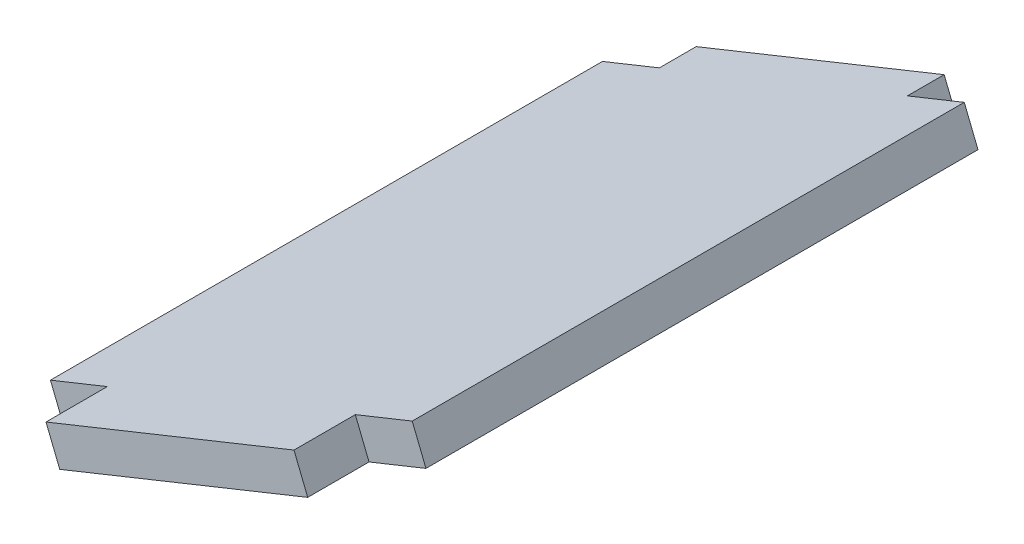
ISO-10303-21;
HEADER;
FILE_DESCRIPTION(('STEP AP214'),'2;1');
FILE_NAME('part.step','',(''),(''),'','','');
FILE_SCHEMA(('AUTOMOTIVE_DESIGN { 1 0 10303 214 1 1 1 1 }'));
ENDSEC;
DATA;
#1=APPLICATION_CONTEXT('core data for automotive mechanical design processes');
#2=APPLICATION_PROTOCOL_DEFINITION('international standard','automotive_design',2000,#1);
#3=PRODUCT_CONTEXT('',#1,'mechanical');
#4=PRODUCT('Part','Part','',(#3));
#5=PRODUCT_RELATED_PRODUCT_CATEGORY('part','',(#4));
#6=PRODUCT_DEFINITION_FORMATION('','',#4);
#7=PRODUCT_DEFINITION_CONTEXT('part definition',#1,'design');
#8=PRODUCT_DEFINITION('design','',#6,#7);
#9=PRODUCT_DEFINITION_SHAPE('','',#8);
#10=(LENGTH_UNIT() NAMED_UNIT(*) SI_UNIT(.MILLI.,.METRE.));
#11=(NAMED_UNIT(*) PLANE_ANGLE_UNIT() SI_UNIT($,.RADIAN.));
#12=(NAMED_UNIT(*) SI_UNIT($,.STERADIAN.) SOLID_ANGLE_UNIT());
#13=UNCERTAINTY_MEASURE_WITH_UNIT(LENGTH_MEASURE(1.E-05),#10,'distance_accuracy_value','');
#14=(GEOMETRIC_REPRESENTATION_CONTEXT(3) GLOBAL_UNCERTAINTY_ASSIGNED_CONTEXT((#13)) GLOBAL_UNIT_ASSIGNED_CONTEXT((#10,
#11,#12)) REPRESENTATION_CONTEXT('',''));
#15=CARTESIAN_POINT('',(0.,0.,0.));
#16=DIRECTION('',(0.,0.,1.));
#17=DIRECTION('',(1.,0.,0.));
#18=AXIS2_PLACEMENT_3D('',#15,#16,#17);
#19=CARTESIAN_POINT('',(177.803209237154,-77.3779118691354,-71.9612262261891));
#20=DIRECTION('',(0.92781674820167,0.373036300856202,0.));
#21=DIRECTION('',(-0.373036300856202,0.92781674820167,0.));
#22=AXIS2_PLACEMENT_3D('',#19,#20,#21);
#23=PLANE('',#22);
#24=DIRECTION('',(0.,0.,1.));
#25=VECTOR('',#24,1.);
#26=CARTESIAN_POINT('',(178.922318139722,-80.1613621137405,-71.9612262261891));
#27=LINE('',#26,#25);
#28=CARTESIAN_POINT('',(178.922318139723,-80.1613621137401,0.));
#29=VERTEX_POINT('',#28);
#30=CARTESIAN_POINT('',(178.922318139722,-80.1613621137405,5.));
#31=VERTEX_POINT('',#30);
#32=EDGE_CURVE('E146',#29,#31,#27,.T.);
#33=ORIENTED_EDGE('',*,*,#32,.T.);
#34=DIRECTION('',(-0.373036300856202,0.92781674820167,0.));
#35=VECTOR('',#34,1.);
#36=CARTESIAN_POINT('',(177.803209237154,-77.3779118691354,5.));
#37=LINE('',#36,#35);
#38=CARTESIAN_POINT('',(177.803209237154,-77.3779118691354,5.));
#39=VERTEX_POINT('',#38);
#40=EDGE_CURVE('E230',#31,#39,#37,.T.);
#41=ORIENTED_EDGE('',*,*,#40,.T.);
#42=DIRECTION('',(0.,0.,1.));
#43=VECTOR('',#42,1.);
#44=CARTESIAN_POINT('',(177.803209237154,-77.3779118691354,-71.9612262261891));
#45=LINE('',#44,#43);
#46=CARTESIAN_POINT('',(177.803209237154,-77.3779118691352,0.));
#47=VERTEX_POINT('',#46);
#48=EDGE_CURVE('E196',#47,#39,#45,.T.);
#49=ORIENTED_EDGE('',*,*,#48,.F.);
#50=DIRECTION('',(-0.373036300856202,0.92781674820167,0.));
#51=VECTOR('',#50,1.);
#52=CARTESIAN_POINT('',(177.803209237154,-77.3779118691352,0.));
#53=LINE('',#52,#51);
#54=EDGE_CURVE('E154',#29,#47,#53,.T.);
#55=ORIENTED_EDGE('',*,*,#54,.F.);
#56=EDGE_LOOP('',(#33,#41,#49,#55));
#57=FACE_BOUND('',#56,.T.);
#58=ADVANCED_FACE('F33',(#57),#23,.F.);
#59=CARTESIAN_POINT('',(199.136249233887,-72.0341860353339,-71.9612262261891));
#60=DIRECTION('',(-0.927816748201669,-0.373036300856205,0.));
#61=DIRECTION('',(0.373036300856205,-0.927816748201669,0.));
#62=AXIS2_PLACEMENT_3D('',#59,#60,#61);
#63=PLANE('',#62);
#64=DIRECTION('',(-0.373036300856208,0.927816748201667,0.));
#65=VECTOR('',#64,1.);
#66=CARTESIAN_POINT('',(198.017140331318,-69.2507357907289,0.));
#67=LINE('',#66,#65);
#68=CARTESIAN_POINT('',(199.136249233887,-72.0341860353339,0.));
#69=VERTEX_POINT('',#68);
#70=CARTESIAN_POINT('',(198.017140331318,-69.2507357907289,0.));
#71=VERTEX_POINT('',#70);
#72=EDGE_CURVE('E147',#69,#71,#67,.T.);
#73=ORIENTED_EDGE('',*,*,#72,.T.);
#74=DIRECTION('',(0.,0.,1.));
#75=VECTOR('',#74,1.);
#76=CARTESIAN_POINT('',(198.017140331318,-69.2507357907289,-71.9612262261891));
#77=LINE('',#76,#75);
#78=CARTESIAN_POINT('',(198.017140331318,-69.2507357907289,5.));
#79=VERTEX_POINT('',#78);
#80=EDGE_CURVE('E216',#71,#79,#77,.T.);
#81=ORIENTED_EDGE('',*,*,#80,.T.);
#82=DIRECTION('',(0.373036300856205,-0.927816748201669,0.));
#83=VECTOR('',#82,1.);
#84=CARTESIAN_POINT('',(199.136249233887,-72.0341860353339,5.));
#85=LINE('',#84,#83);
#86=CARTESIAN_POINT('',(199.136249233887,-72.0341860353339,5.));
#87=VERTEX_POINT('',#86);
#88=EDGE_CURVE('E225',#79,#87,#85,.T.);
#89=ORIENTED_EDGE('',*,*,#88,.T.);
#90=DIRECTION('',(0.,0.,1.));
#91=VECTOR('',#90,1.);
#92=CARTESIAN_POINT('',(199.136249233887,-72.0341860353339,-71.9612262261891));
#93=LINE('',#92,#91);
#94=EDGE_CURVE('E209',#69,#87,#93,.T.);
#95=ORIENTED_EDGE('',*,*,#94,.F.);
#96=EDGE_LOOP('',(#73,#81,#89,#95));
#97=FACE_BOUND('',#96,.T.);
#98=ADVANCED_FACE('F263',(#97),#63,.F.);
#99=DIRECTION('',(0.373036300856205,-0.927816748201669,0.));
#100=VECTOR('',#99,1.);
#101=CARTESIAN_POINT('',(198.017140331318,-69.2507357907289,-45.));
#102=LINE('',#101,#100);
#103=CARTESIAN_POINT('',(198.017140331318,-69.2507357907289,-45.));
#104=VERTEX_POINT('',#103);
#105=CARTESIAN_POINT('',(199.136249233887,-72.0341860353339,-45.));
#106=VERTEX_POINT('',#105);
#107=EDGE_CURVE('E149',#104,#106,#102,.T.);
#108=ORIENTED_EDGE('',*,*,#107,.T.);
#109=CARTESIAN_POINT('',(199.136249233887,-72.0341860353339,-48.));
#110=VERTEX_POINT('',#109);
#111=EDGE_CURVE('E206',#110,#106,#93,.T.);
#112=ORIENTED_EDGE('',*,*,#111,.F.);
#113=DIRECTION('',(-0.373036300856205,0.927816748201669,0.));
#114=VECTOR('',#113,1.);
#115=CARTESIAN_POINT('',(199.136249233887,-72.0341860353339,-48.));
#116=LINE('',#115,#114);
#117=CARTESIAN_POINT('',(198.017140331318,-69.2507357907289,-48.));
#118=VERTEX_POINT('',#117);
#119=EDGE_CURVE('E193',#110,#118,#116,.T.);
#120=ORIENTED_EDGE('',*,*,#119,.T.);
#121=EDGE_CURVE('E213',#118,#104,#77,.T.);
#122=ORIENTED_EDGE('',*,*,#121,.T.);
#123=EDGE_LOOP('',(#108,#112,#120,#122));
#124=FACE_BOUND('',#123,.T.);
#125=ADVANCED_FACE('F271',(#124),#63,.F.);
#126=CARTESIAN_POINT('',(198.017140331318,-69.2507357907289,-71.9612262261891));
#127=DIRECTION('',(0.373036300856209,-0.927816748201667,0.));
#128=DIRECTION('',(0.927816748201667,0.373036300856209,0.));
#129=AXIS2_PLACEMENT_3D('',#126,#127,#128);
#130=PLANE('',#129);
#131=DIRECTION('',(-0.927816748201667,-0.373036300856209,0.));
#132=VECTOR('',#131,1.);
#133=CARTESIAN_POINT('',(198.017140331318,-69.2507357907289,-48.));
#134=LINE('',#133,#132);
#135=CARTESIAN_POINT('',(177.803209237154,-77.3779118691354,-48.));
#136=VERTEX_POINT('',#135);
#137=EDGE_CURVE('E42',#118,#136,#134,.T.);
#138=ORIENTED_EDGE('',*,*,#137,.T.);
#139=CARTESIAN_POINT('',(177.803209237154,-77.3779118691351,-45.));
#140=VERTEX_POINT('',#139);
#141=EDGE_CURVE('E185',#136,#140,#45,.T.);
#142=ORIENTED_EDGE('',*,*,#141,.T.);
#143=DIRECTION('',(0.927816748201669,0.373036300856205,0.));
#144=VECTOR('',#143,1.);
#145=CARTESIAN_POINT('',(173.164125496146,-79.2430933734162,-45.));
#146=LINE('',#145,#144);
#147=CARTESIAN_POINT('',(173.164125496146,-79.2430933734162,-45.));
#148=VERTEX_POINT('',#147);
#149=EDGE_CURVE('E151',#148,#140,#146,.T.);
#150=ORIENTED_EDGE('',*,*,#149,.F.);
#151=DIRECTION('',(0.,0.,-1.));
#152=VECTOR('',#151,1.);
#153=CARTESIAN_POINT('',(173.164125496146,-79.2430933734162,0.));
#154=LINE('',#153,#152);
#155=CARTESIAN_POINT('',(173.164125496146,-79.2430933734162,0.));
#156=VERTEX_POINT('',#155);
#157=EDGE_CURVE('E162',#156,#148,#154,.T.);
#158=ORIENTED_EDGE('',*,*,#157,.F.);
#159=DIRECTION('',(0.927816748201669,0.373036300856205,0.));
#160=VECTOR('',#159,1.);
#161=CARTESIAN_POINT('',(173.164125496146,-79.2430933734162,0.));
#162=LINE('',#161,#160);
#163=EDGE_CURVE('E133',#156,#47,#162,.T.);
#164=ORIENTED_EDGE('',*,*,#163,.T.);
#165=ORIENTED_EDGE('',*,*,#48,.T.);
#166=DIRECTION('',(0.927816748201667,0.373036300856209,0.));
#167=VECTOR('',#166,1.);
#168=CARTESIAN_POINT('',(198.017140331318,-69.2507357907289,5.));
#169=LINE('',#168,#167);
#170=EDGE_CURVE('E212',#39,#79,#169,.T.);
#171=ORIENTED_EDGE('',*,*,#170,.T.);
#172=ORIENTED_EDGE('',*,*,#80,.F.);
#173=DIRECTION('',(-0.927816748201669,-0.373036300856205,0.));
#174=VECTOR('',#173,1.);
#175=CARTESIAN_POINT('',(202.656224072327,-67.3855542864479,0.));
#176=LINE('',#175,#174);
#177=CARTESIAN_POINT('',(202.656224072327,-67.3855542864479,0.));
#178=VERTEX_POINT('',#177);
#179=EDGE_CURVE('E58',#178,#71,#176,.T.);
#180=ORIENTED_EDGE('',*,*,#179,.F.);
#181=DIRECTION('',(0.,0.,-1.));
#182=VECTOR('',#181,1.);
#183=CARTESIAN_POINT('',(202.656224072327,-67.3855542864479,0.));
#184=LINE('',#183,#182);
#185=CARTESIAN_POINT('',(202.656224072327,-67.3855542864479,-45.));
#186=VERTEX_POINT('',#185);
#187=EDGE_CURVE('E281',#178,#186,#184,.T.);
#188=ORIENTED_EDGE('',*,*,#187,.T.);
#189=DIRECTION('',(-0.927816748201669,-0.373036300856205,0.));
#190=VECTOR('',#189,1.);
#191=CARTESIAN_POINT('',(202.656224072327,-67.3855542864479,-45.));
#192=LINE('',#191,#190);
#193=EDGE_CURVE('E241',#186,#104,#192,.T.);
#194=ORIENTED_EDGE('',*,*,#193,.T.);
#195=ORIENTED_EDGE('',*,*,#121,.F.);
#196=EDGE_LOOP('',(#138,#142,#150,#158,#164,#165,#171,#172,#180,#188,#194,#195));
#197=FACE_BOUND('',#196,.T.);
#198=ADVANCED_FACE('F183',(#197),#130,.F.);
#199=ORIENTED_EDGE('',*,*,#141,.F.);
#200=DIRECTION('',(0.373036300856202,-0.92781674820167,0.));
#201=VECTOR('',#200,1.);
#202=CARTESIAN_POINT('',(177.803209237154,-77.3779118691354,-48.));
#203=LINE('',#202,#201);
#204=CARTESIAN_POINT('',(178.922318139722,-80.1613621137405,-48.));
#205=VERTEX_POINT('',#204);
#206=EDGE_CURVE('E11',#136,#205,#203,.T.);
#207=ORIENTED_EDGE('',*,*,#206,.T.);
#208=CARTESIAN_POINT('',(178.922318139722,-80.1613621137405,-45.));
#209=VERTEX_POINT('',#208);
#210=EDGE_CURVE('E190',#205,#209,#27,.T.);
#211=ORIENTED_EDGE('',*,*,#210,.T.);
#212=DIRECTION('',(0.373036300856205,-0.927816748201669,0.));
#213=VECTOR('',#212,1.);
#214=CARTESIAN_POINT('',(177.803209237154,-77.3779118691351,-45.));
#215=LINE('',#214,#213);
#216=EDGE_CURVE('E138',#140,#209,#215,.T.);
#217=ORIENTED_EDGE('',*,*,#216,.F.);
#218=EDGE_LOOP('',(#199,#207,#211,#217));
#219=FACE_BOUND('',#218,.T.);
#220=ADVANCED_FACE('F191',(#219),#23,.F.);
#221=CARTESIAN_POINT('',(178.922318139722,-80.1613621137405,-71.9612262261891));
#222=DIRECTION('',(-0.37303630085621,0.927816748201667,0.));
#223=DIRECTION('',(-0.927816748201667,-0.37303630085621,0.));
#224=AXIS2_PLACEMENT_3D('',#221,#222,#223);
#225=PLANE('',#224);
#226=DIRECTION('',(0.927816748201667,0.37303630085621,0.));
#227=VECTOR('',#226,1.);
#228=CARTESIAN_POINT('',(178.922318139722,-80.1613621137405,-48.));
#229=LINE('',#228,#227);
#230=EDGE_CURVE('E192',#205,#110,#229,.T.);
#231=ORIENTED_EDGE('',*,*,#230,.T.);
#232=ORIENTED_EDGE('',*,*,#111,.T.);
#233=DIRECTION('',(-0.927816748201669,-0.373036300856205,0.));
#234=VECTOR('',#233,1.);
#235=CARTESIAN_POINT('',(203.775332974895,-70.1690045310529,-45.));
#236=LINE('',#235,#234);
#237=CARTESIAN_POINT('',(203.775332974895,-70.1690045310529,-45.));
#238=VERTEX_POINT('',#237);
#239=EDGE_CURVE('E239',#238,#106,#236,.T.);
#240=ORIENTED_EDGE('',*,*,#239,.F.);
#241=DIRECTION('',(0.,0.,1.));
#242=VECTOR('',#241,1.);
#243=CARTESIAN_POINT('',(203.775332974895,-70.1690045310529,0.));
#244=LINE('',#243,#242);
#245=CARTESIAN_POINT('',(203.775332974895,-70.1690045310529,0.));
#246=VERTEX_POINT('',#245);
#247=EDGE_CURVE('E252',#238,#246,#244,.T.);
#248=ORIENTED_EDGE('',*,*,#247,.T.);
#249=DIRECTION('',(-0.927816748201669,-0.373036300856205,0.));
#250=VECTOR('',#249,1.);
#251=CARTESIAN_POINT('',(203.775332974895,-70.1690045310529,0.));
#252=LINE('',#251,#250);
#253=EDGE_CURVE('E242',#246,#69,#252,.T.);
#254=ORIENTED_EDGE('',*,*,#253,.T.);
#255=ORIENTED_EDGE('',*,*,#94,.T.);
#256=DIRECTION('',(-0.927816748201667,-0.37303630085621,0.));
#257=VECTOR('',#256,1.);
#258=CARTESIAN_POINT('',(178.922318139722,-80.1613621137405,5.));
#259=LINE('',#258,#257);
#260=EDGE_CURVE('E228',#87,#31,#259,.T.);
#261=ORIENTED_EDGE('',*,*,#260,.T.);
#262=ORIENTED_EDGE('',*,*,#32,.F.);
#263=DIRECTION('',(0.927816748201669,0.373036300856205,0.));
#264=VECTOR('',#263,1.);
#265=CARTESIAN_POINT('',(174.283234398714,-82.0265436180212,0.));
#266=LINE('',#265,#264);
#267=CARTESIAN_POINT('',(174.283234398714,-82.0265436180212,0.));
#268=VERTEX_POINT('',#267);
#269=EDGE_CURVE('E131',#268,#29,#266,.T.);
#270=ORIENTED_EDGE('',*,*,#269,.F.);
#271=DIRECTION('',(0.,0.,1.));
#272=VECTOR('',#271,1.);
#273=CARTESIAN_POINT('',(174.283234398714,-82.0265436180212,0.));
#274=LINE('',#273,#272);
#275=CARTESIAN_POINT('',(174.283234398714,-82.0265436180212,-45.));
#276=VERTEX_POINT('',#275);
#277=EDGE_CURVE('E137',#276,#268,#274,.T.);
#278=ORIENTED_EDGE('',*,*,#277,.F.);
#279=DIRECTION('',(0.927816748201669,0.373036300856205,0.));
#280=VECTOR('',#279,1.);
#281=CARTESIAN_POINT('',(174.283234398714,-82.0265436180212,-45.));
#282=LINE('',#281,#280);
#283=EDGE_CURVE('E50',#276,#209,#282,.T.);
#284=ORIENTED_EDGE('',*,*,#283,.T.);
#285=ORIENTED_EDGE('',*,*,#210,.F.);
#286=EDGE_LOOP('',(#231,#232,#240,#248,#254,#255,#261,#262,#270,#278,#284,#285));
#287=FACE_BOUND('',#286,.T.);
#288=ADVANCED_FACE('F144',(#287),#225,.F.);
#289=CARTESIAN_POINT('',(0.,0.,-48.));
#290=DIRECTION('',(0.,0.,-1.));
#291=DIRECTION('',(0.,-1.,0.));
#292=AXIS2_PLACEMENT_3D('',#289,#290,#291);
#293=PLANE('',#292);
#294=ORIENTED_EDGE('',*,*,#230,.F.);
#295=ORIENTED_EDGE('',*,*,#206,.F.);
#296=ORIENTED_EDGE('',*,*,#137,.F.);
#297=ORIENTED_EDGE('',*,*,#119,.F.);
#298=EDGE_LOOP('',(#294,#295,#296,#297));
#299=FACE_BOUND('',#298,.T.);
#300=ADVANCED_FACE('F35',(#299),#293,.T.);
#301=CARTESIAN_POINT('',(0.,0.,5.));
#302=DIRECTION('',(0.,0.,-1.));
#303=DIRECTION('',(0.,-1.,0.));
#304=AXIS2_PLACEMENT_3D('',#301,#302,#303);
#305=PLANE('',#304);
#306=ORIENTED_EDGE('',*,*,#88,.F.);
#307=ORIENTED_EDGE('',*,*,#170,.F.);
#308=ORIENTED_EDGE('',*,*,#40,.F.);
#309=ORIENTED_EDGE('',*,*,#260,.F.);
#310=EDGE_LOOP('',(#306,#307,#308,#309));
#311=FACE_BOUND('',#310,.T.);
#312=ADVANCED_FACE('F259',(#311),#305,.F.);
#313=CARTESIAN_POINT('',(202.656224072327,-67.3855542864479,0.));
#314=DIRECTION('',(0.,0.,-1.));
#315=DIRECTION('',(0.,-1.,0.));
#316=AXIS2_PLACEMENT_3D('',#313,#314,#315);
#317=PLANE('',#316);
#318=ORIENTED_EDGE('',*,*,#72,.F.);
#319=ORIENTED_EDGE('',*,*,#253,.F.);
#320=DIRECTION('',(-0.373036300856208,0.927816748201667,0.));
#321=VECTOR('',#320,1.);
#322=CARTESIAN_POINT('',(202.656224072327,-67.3855542864479,0.));
#323=LINE('',#322,#321);
#324=EDGE_CURVE('E166',#246,#178,#323,.T.);
#325=ORIENTED_EDGE('',*,*,#324,.T.);
#326=ORIENTED_EDGE('',*,*,#179,.T.);
#327=EDGE_LOOP('',(#318,#319,#325,#326));
#328=FACE_BOUND('',#327,.T.);
#329=ADVANCED_FACE('F285',(#328),#317,.F.);
#330=CARTESIAN_POINT('',(202.656224072327,-67.3855542864479,-45.));
#331=DIRECTION('',(0.,0.,1.));
#332=DIRECTION('',(-1.,0.,0.));
#333=AXIS2_PLACEMENT_3D('',#330,#331,#332);
#334=PLANE('',#333);
#335=ORIENTED_EDGE('',*,*,#107,.F.);
#336=ORIENTED_EDGE('',*,*,#193,.F.);
#337=DIRECTION('',(0.373036300856205,-0.927816748201669,0.));
#338=VECTOR('',#337,1.);
#339=CARTESIAN_POINT('',(202.656224072327,-67.3855542864479,-45.));
#340=LINE('',#339,#338);
#341=EDGE_CURVE('E277',#186,#238,#340,.T.);
#342=ORIENTED_EDGE('',*,*,#341,.T.);
#343=ORIENTED_EDGE('',*,*,#239,.T.);
#344=EDGE_LOOP('',(#335,#336,#342,#343));
#345=FACE_BOUND('',#344,.T.);
#346=ADVANCED_FACE('F275',(#345),#334,.F.);
#347=CARTESIAN_POINT('',(151.132609101368,60.7640997505116,0.));
#348=DIRECTION('',(-0.927816748201668,-0.373036300856208,0.));
#349=DIRECTION('',(0.373036300856208,-0.927816748201668,0.));
#350=AXIS2_PLACEMENT_3D('',#347,#348,#349);
#351=PLANE('',#350);
#352=ORIENTED_EDGE('',*,*,#324,.F.);
#353=ORIENTED_EDGE('',*,*,#247,.F.);
#354=ORIENTED_EDGE('',*,*,#341,.F.);
#355=ORIENTED_EDGE('',*,*,#187,.F.);
#356=EDGE_LOOP('',(#352,#353,#354,#355));
#357=FACE_BOUND('',#356,.T.);
#358=ADVANCED_FACE('F283',(#357),#351,.F.);
#359=CARTESIAN_POINT('',(173.164125496146,-79.2430933734162,0.));
#360=DIRECTION('',(0.,0.,1.));
#361=DIRECTION('',(0.,1.,0.));
#362=AXIS2_PLACEMENT_3D('',#359,#360,#361);
#363=PLANE('',#362);
#364=ORIENTED_EDGE('',*,*,#54,.T.);
#365=ORIENTED_EDGE('',*,*,#163,.F.);
#366=DIRECTION('',(-0.373036300856202,0.92781674820167,0.));
#367=VECTOR('',#366,1.);
#368=CARTESIAN_POINT('',(173.164125496146,-79.2430933734162,0.));
#369=LINE('',#368,#367);
#370=EDGE_CURVE('E126',#268,#156,#369,.T.);
#371=ORIENTED_EDGE('',*,*,#370,.F.);
#372=ORIENTED_EDGE('',*,*,#269,.T.);
#373=EDGE_LOOP('',(#364,#365,#371,#372));
#374=FACE_BOUND('',#373,.T.);
#375=ADVANCED_FACE('F129',(#374),#363,.T.);
#376=CARTESIAN_POINT('',(173.164125496146,-79.2430933734162,-45.));
#377=DIRECTION('',(0.,0.,-1.));
#378=DIRECTION('',(1.,0.,0.));
#379=AXIS2_PLACEMENT_3D('',#376,#377,#378);
#380=PLANE('',#379);
#381=ORIENTED_EDGE('',*,*,#216,.T.);
#382=ORIENTED_EDGE('',*,*,#283,.F.);
#383=DIRECTION('',(0.373036300856205,-0.927816748201669,0.));
#384=VECTOR('',#383,1.);
#385=CARTESIAN_POINT('',(173.164125496146,-79.2430933734162,-45.));
#386=LINE('',#385,#384);
#387=EDGE_CURVE('E141',#148,#276,#386,.T.);
#388=ORIENTED_EDGE('',*,*,#387,.F.);
#389=ORIENTED_EDGE('',*,*,#149,.T.);
#390=EDGE_LOOP('',(#381,#382,#388,#389));
#391=FACE_BOUND('',#390,.T.);
#392=ADVANCED_FACE('F187',(#391),#380,.T.);
#393=CARTESIAN_POINT('',(121.640510525187,48.9065606635437,0.));
#394=DIRECTION('',(0.92781674820167,0.373036300856202,0.));
#395=DIRECTION('',(0.373036300856202,-0.92781674820167,0.));
#396=AXIS2_PLACEMENT_3D('',#393,#394,#395);
#397=PLANE('',#396);
#398=ORIENTED_EDGE('',*,*,#370,.T.);
#399=ORIENTED_EDGE('',*,*,#157,.T.);
#400=ORIENTED_EDGE('',*,*,#387,.T.);
#401=ORIENTED_EDGE('',*,*,#277,.T.);
#402=EDGE_LOOP('',(#398,#399,#400,#401));
#403=FACE_BOUND('',#402,.T.);
#404=ADVANCED_FACE('F140',(#403),#397,.F.);
#405=CLOSED_SHELL('',(#58,#98,#125,#198,#220,#288,#300,#312,#329,#346,#358,#375,#392,#404));
#406=MANIFOLD_SOLID_BREP('B2',#405);
#407=ADVANCED_BREP_SHAPE_REPRESENTATION('',(#18,#406),#14);
#408=SHAPE_DEFINITION_REPRESENTATION(#9,#407);
ENDSEC;
END-ISO-10303-21;
